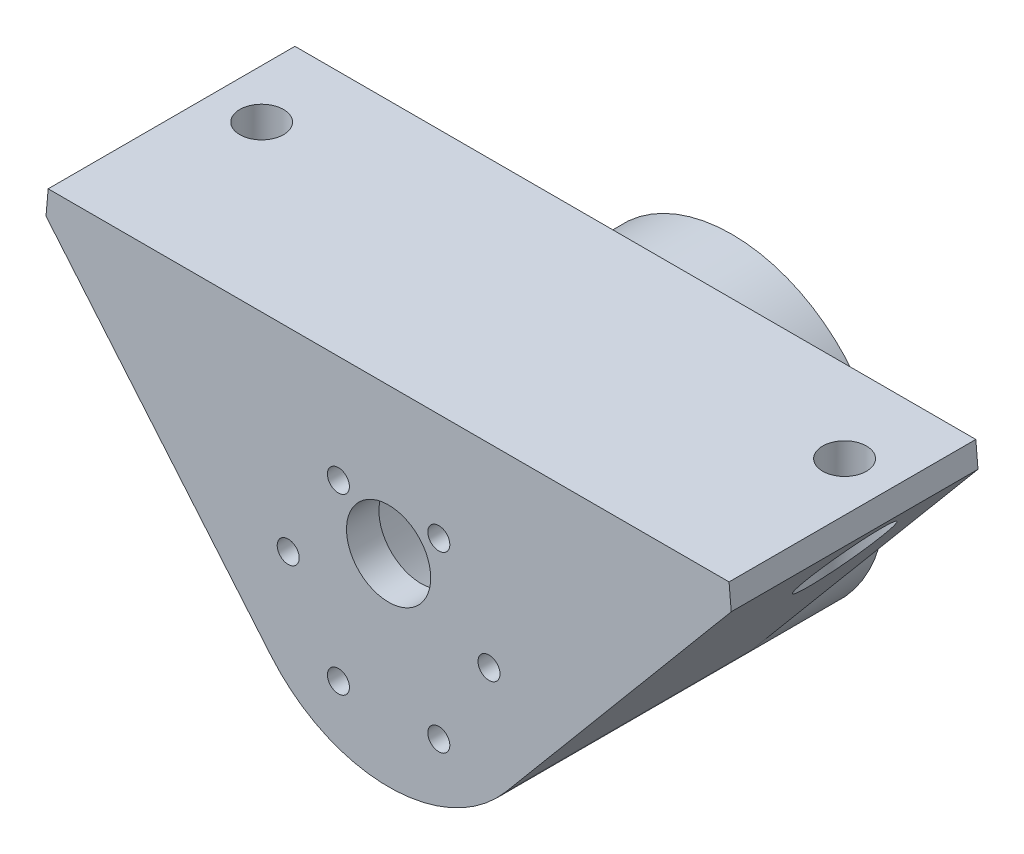
ISO-10303-21;
HEADER;
FILE_DESCRIPTION(('STEP AP214'),'2;1');
FILE_NAME('part.step','',(''),(''),'','','');
FILE_SCHEMA(('AUTOMOTIVE_DESIGN { 1 0 10303 214 1 1 1 1 }'));
ENDSEC;
DATA;
#1=APPLICATION_CONTEXT('core data for automotive mechanical design processes');
#2=APPLICATION_PROTOCOL_DEFINITION('international standard','automotive_design',2000,#1);
#3=PRODUCT_CONTEXT('',#1,'mechanical');
#4=PRODUCT('Part','Part','',(#3));
#5=PRODUCT_RELATED_PRODUCT_CATEGORY('part','',(#4));
#6=PRODUCT_DEFINITION_FORMATION('','',#4);
#7=PRODUCT_DEFINITION_CONTEXT('part definition',#1,'design');
#8=PRODUCT_DEFINITION('design','',#6,#7);
#9=PRODUCT_DEFINITION_SHAPE('','',#8);
#10=(LENGTH_UNIT() NAMED_UNIT(*) SI_UNIT(.MILLI.,.METRE.));
#11=(NAMED_UNIT(*) PLANE_ANGLE_UNIT() SI_UNIT($,.RADIAN.));
#12=(NAMED_UNIT(*) SI_UNIT($,.STERADIAN.) SOLID_ANGLE_UNIT());
#13=UNCERTAINTY_MEASURE_WITH_UNIT(LENGTH_MEASURE(1.E-05),#10,'distance_accuracy_value','');
#14=(GEOMETRIC_REPRESENTATION_CONTEXT(3) GLOBAL_UNCERTAINTY_ASSIGNED_CONTEXT((#13)) GLOBAL_UNIT_ASSIGNED_CONTEXT((#10,
#11,#12)) REPRESENTATION_CONTEXT('',''));
#15=CARTESIAN_POINT('',(0.,0.,0.));
#16=DIRECTION('',(0.,0.,1.));
#17=DIRECTION('',(1.,0.,0.));
#18=AXIS2_PLACEMENT_3D('',#15,#16,#17);
#19=CARTESIAN_POINT('',(0.,0.,-48.));
#20=DIRECTION('',(0.,0.,1.));
#21=DIRECTION('',(1.,0.,0.));
#22=AXIS2_PLACEMENT_3D('',#19,#20,#21);
#23=CYLINDRICAL_SURFACE('',#22,18.7);
#24=CARTESIAN_POINT('',(0.,0.,-48.));
#25=DIRECTION('',(0.,0.,1.));
#26=DIRECTION('',(1.,0.,0.));
#27=AXIS2_PLACEMENT_3D('',#24,#25,#26);
#28=CIRCLE('',#27,18.7);
#29=CARTESIAN_POINT('',(18.7,0.,-48.));
#30=VERTEX_POINT('',#29);
#31=EDGE_CURVE('E166',#30,#30,#28,.T.);
#32=ORIENTED_EDGE('',*,*,#31,.F.);
#33=EDGE_LOOP('',(#32));
#34=FACE_BOUND('',#33,.T.);
#35=CARTESIAN_POINT('',(0.,0.,0.));
#36=DIRECTION('',(0.,0.,1.));
#37=DIRECTION('',(1.,0.,0.));
#38=AXIS2_PLACEMENT_3D('',#35,#36,#37);
#39=CIRCLE('',#38,18.7);
#40=CARTESIAN_POINT('',(18.7,0.,0.));
#41=VERTEX_POINT('',#40);
#42=EDGE_CURVE('E163',#41,#41,#39,.T.);
#43=ORIENTED_EDGE('',*,*,#42,.T.);
#44=EDGE_LOOP('',(#43));
#45=FACE_BOUND('',#44,.T.);
#46=ADVANCED_FACE('F43',(#34,#45),#23,.F.);
#47=CARTESIAN_POINT('',(0.,0.,-48.));
#48=DIRECTION('',(0.,0.,1.));
#49=DIRECTION('',(1.,0.,0.));
#50=AXIS2_PLACEMENT_3D('',#47,#48,#49);
#51=CYLINDRICAL_SURFACE('',#50,23.7);
#52=DIRECTION('',(0.,0.,1.));
#53=VECTOR('',#52,1.);
#54=CARTESIAN_POINT('',(18.1552533019198,-15.234066349571,-33.1));
#55=LINE('',#54,#53);
#56=CARTESIAN_POINT('',(18.1552533019198,-15.234066349571,-33.1));
#57=VERTEX_POINT('',#56);
#58=CARTESIAN_POINT('',(18.1552533019198,-15.234066349571,5.));
#59=VERTEX_POINT('',#58);
#60=EDGE_CURVE('E119',#57,#59,#55,.T.);
#61=ORIENTED_EDGE('',*,*,#60,.T.);
#62=CARTESIAN_POINT('',(0.,0.,5.));
#63=DIRECTION('',(0.,0.,1.));
#64=DIRECTION('',(1.,0.,0.));
#65=AXIS2_PLACEMENT_3D('',#62,#63,#64);
#66=CIRCLE('',#65,23.7);
#67=CARTESIAN_POINT('',(-18.1552533019198,-15.234066349571,5.));
#68=VERTEX_POINT('',#67);
#69=EDGE_CURVE('E118',#68,#59,#66,.T.);
#70=ORIENTED_EDGE('',*,*,#69,.F.);
#71=DIRECTION('',(0.,0.,1.));
#72=VECTOR('',#71,1.);
#73=CARTESIAN_POINT('',(-18.1552533019198,-15.234066349571,-33.1));
#74=LINE('',#73,#72);
#75=CARTESIAN_POINT('',(-18.1552533019198,-15.234066349571,-33.1));
#76=VERTEX_POINT('',#75);
#77=EDGE_CURVE('E100',#76,#68,#74,.T.);
#78=ORIENTED_EDGE('',*,*,#77,.F.);
#79=CARTESIAN_POINT('',(0.,0.,-33.1));
#80=DIRECTION('',(0.,0.,1.));
#81=DIRECTION('',(1.,0.,0.));
#82=AXIS2_PLACEMENT_3D('',#79,#80,#81);
#83=CIRCLE('',#82,23.7);
#84=EDGE_CURVE('E104',#57,#76,#83,.T.);
#85=ORIENTED_EDGE('',*,*,#84,.F.);
#86=EDGE_LOOP('',(#61,#70,#78,#85));
#87=FACE_BOUND('',#86,.T.);
#88=CARTESIAN_POINT('',(0.,0.,-48.));
#89=DIRECTION('',(0.,0.,1.));
#90=DIRECTION('',(1.,0.,0.));
#91=AXIS2_PLACEMENT_3D('',#88,#89,#90);
#92=CIRCLE('',#91,23.7);
#93=CARTESIAN_POINT('',(23.7,0.,-48.));
#94=VERTEX_POINT('',#93);
#95=EDGE_CURVE('E169',#94,#94,#92,.T.);
#96=ORIENTED_EDGE('',*,*,#95,.T.);
#97=EDGE_LOOP('',(#96));
#98=FACE_BOUND('',#97,.T.);
#99=ADVANCED_FACE('F115',(#87,#98),#51,.T.);
#100=CARTESIAN_POINT('',(0.,0.,-48.));
#101=DIRECTION('',(0.,0.,1.));
#102=DIRECTION('',(1.,0.,0.));
#103=AXIS2_PLACEMENT_3D('',#100,#101,#102);
#104=PLANE('',#103);
#105=ORIENTED_EDGE('',*,*,#31,.T.);
#106=EDGE_LOOP('',(#105));
#107=FACE_BOUND('',#106,.T.);
#108=ORIENTED_EDGE('',*,*,#95,.F.);
#109=EDGE_LOOP('',(#108));
#110=FACE_BOUND('',#109,.T.);
#111=ADVANCED_FACE('F268',(#107,#110),#104,.F.);
#112=CARTESIAN_POINT('',(0.,0.,0.));
#113=DIRECTION('',(0.,0.,1.));
#114=DIRECTION('',(1.,0.,0.));
#115=AXIS2_PLACEMENT_3D('',#112,#113,#114);
#116=PLANE('',#115);
#117=CARTESIAN_POINT('',(-7.75000000000016,-13.4233937586587,0.));
#118=DIRECTION('',(0.,0.,1.));
#119=DIRECTION('',(1.,0.,0.));
#120=AXIS2_PLACEMENT_3D('',#117,#118,#119);
#121=CIRCLE('',#120,1.69999999999999);
#122=CARTESIAN_POINT('',(-6.05000000000017,-13.4233937586587,0.));
#123=VERTEX_POINT('',#122);
#124=EDGE_CURVE('E127',#123,#123,#121,.T.);
#125=ORIENTED_EDGE('',*,*,#124,.T.);
#126=EDGE_LOOP('',(#125));
#127=FACE_BOUND('',#126,.T.);
#128=CARTESIAN_POINT('',(7.74999999999987,-13.4233937586589,0.));
#129=DIRECTION('',(0.,0.,1.));
#130=DIRECTION('',(1.,0.,0.));
#131=AXIS2_PLACEMENT_3D('',#128,#129,#130);
#132=CIRCLE('',#131,1.69999999999999);
#133=CARTESIAN_POINT('',(9.44999999999986,-13.4233937586589,0.));
#134=VERTEX_POINT('',#133);
#135=EDGE_CURVE('E133',#134,#134,#132,.T.);
#136=ORIENTED_EDGE('',*,*,#135,.T.);
#137=EDGE_LOOP('',(#136));
#138=FACE_BOUND('',#137,.T.);
#139=CARTESIAN_POINT('',(15.5,0.,0.));
#140=DIRECTION('',(0.,0.,1.));
#141=DIRECTION('',(1.,0.,0.));
#142=AXIS2_PLACEMENT_3D('',#139,#140,#141);
#143=CIRCLE('',#142,1.69999999999999);
#144=CARTESIAN_POINT('',(17.2,0.,0.));
#145=VERTEX_POINT('',#144);
#146=EDGE_CURVE('E139',#145,#145,#143,.T.);
#147=ORIENTED_EDGE('',*,*,#146,.T.);
#148=EDGE_LOOP('',(#147));
#149=FACE_BOUND('',#148,.T.);
#150=CARTESIAN_POINT('',(7.75000000000006,13.4233937586588,0.));
#151=DIRECTION('',(0.,0.,1.));
#152=DIRECTION('',(1.,0.,0.));
#153=AXIS2_PLACEMENT_3D('',#150,#151,#152);
#154=CIRCLE('',#153,1.69999999999999);
#155=CARTESIAN_POINT('',(9.45000000000005,13.4233937586588,0.));
#156=VERTEX_POINT('',#155);
#157=EDGE_CURVE('E145',#156,#156,#154,.T.);
#158=ORIENTED_EDGE('',*,*,#157,.T.);
#159=EDGE_LOOP('',(#158));
#160=FACE_BOUND('',#159,.T.);
#161=CARTESIAN_POINT('',(-7.74999999999997,13.4233937586588,0.));
#162=DIRECTION('',(0.,0.,1.));
#163=DIRECTION('',(1.,0.,0.));
#164=AXIS2_PLACEMENT_3D('',#161,#162,#163);
#165=CIRCLE('',#164,1.69999999999999);
#166=CARTESIAN_POINT('',(-6.04999999999998,13.4233937586588,0.));
#167=VERTEX_POINT('',#166);
#168=EDGE_CURVE('E151',#167,#167,#165,.T.);
#169=ORIENTED_EDGE('',*,*,#168,.T.);
#170=EDGE_LOOP('',(#169));
#171=FACE_BOUND('',#170,.T.);
#172=CARTESIAN_POINT('',(-15.5,0.,0.));
#173=DIRECTION('',(0.,0.,1.));
#174=DIRECTION('',(1.,0.,0.));
#175=AXIS2_PLACEMENT_3D('',#172,#173,#174);
#176=CIRCLE('',#175,1.69999999999999);
#177=CARTESIAN_POINT('',(-13.8,0.,0.));
#178=VERTEX_POINT('',#177);
#179=EDGE_CURVE('E155',#178,#178,#176,.T.);
#180=ORIENTED_EDGE('',*,*,#179,.T.);
#181=EDGE_LOOP('',(#180));
#182=FACE_BOUND('',#181,.T.);
#183=CARTESIAN_POINT('',(0.,7.5,0.));
#184=DIRECTION('',(0.,0.,1.));
#185=DIRECTION('',(1.,0.,0.));
#186=AXIS2_PLACEMENT_3D('',#183,#184,#185);
#187=CIRCLE('',#186,6.5);
#188=CARTESIAN_POINT('',(6.5,7.5,0.));
#189=VERTEX_POINT('',#188);
#190=EDGE_CURVE('E158',#189,#189,#187,.T.);
#191=ORIENTED_EDGE('',*,*,#190,.T.);
#192=EDGE_LOOP('',(#191));
#193=FACE_BOUND('',#192,.T.);
#194=ORIENTED_EDGE('',*,*,#42,.F.);
#195=EDGE_LOOP('',(#194));
#196=FACE_BOUND('',#195,.T.);
#197=ADVANCED_FACE('F336',(#127,#138,#149,#160,#171,#182,#193,#196),#116,.F.);
#198=CARTESIAN_POINT('',(0.,7.5,5.));
#199=DIRECTION('',(0.,0.,-1.));
#200=DIRECTION('',(-1.,0.,0.));
#201=AXIS2_PLACEMENT_3D('',#198,#199,#200);
#202=CYLINDRICAL_SURFACE('',#201,6.5);
#203=CARTESIAN_POINT('',(0.,7.5,5.));
#204=DIRECTION('',(0.,0.,1.));
#205=DIRECTION('',(1.,0.,0.));
#206=AXIS2_PLACEMENT_3D('',#203,#204,#205);
#207=CIRCLE('',#206,6.5);
#208=CARTESIAN_POINT('',(6.5,7.5,5.));
#209=VERTEX_POINT('',#208);
#210=EDGE_CURVE('E160',#209,#209,#207,.T.);
#211=ORIENTED_EDGE('',*,*,#210,.T.);
#212=EDGE_LOOP('',(#211));
#213=FACE_BOUND('',#212,.T.);
#214=ORIENTED_EDGE('',*,*,#190,.F.);
#215=EDGE_LOOP('',(#214));
#216=FACE_BOUND('',#215,.T.);
#217=ADVANCED_FACE('F334',(#213,#216),#202,.F.);
#218=CARTESIAN_POINT('',(0.,0.,5.));
#219=DIRECTION('',(0.,0.,1.));
#220=DIRECTION('',(1.,0.,0.));
#221=AXIS2_PLACEMENT_3D('',#218,#219,#220);
#222=PLANE('',#221);
#223=CARTESIAN_POINT('',(-7.75000000000016,-13.4233937586587,5.));
#224=DIRECTION('',(0.,0.,1.));
#225=DIRECTION('',(1.,0.,0.));
#226=AXIS2_PLACEMENT_3D('',#223,#224,#225);
#227=CIRCLE('',#226,1.69999999999999);
#228=CARTESIAN_POINT('',(-6.05000000000017,-13.4233937586587,5.));
#229=VERTEX_POINT('',#228);
#230=EDGE_CURVE('E121',#229,#229,#227,.T.);
#231=ORIENTED_EDGE('',*,*,#230,.F.);
#232=EDGE_LOOP('',(#231));
#233=FACE_BOUND('',#232,.T.);
#234=CARTESIAN_POINT('',(7.74999999999987,-13.4233937586589,5.));
#235=DIRECTION('',(0.,0.,1.));
#236=DIRECTION('',(1.,0.,0.));
#237=AXIS2_PLACEMENT_3D('',#234,#235,#236);
#238=CIRCLE('',#237,1.69999999999999);
#239=CARTESIAN_POINT('',(9.44999999999986,-13.4233937586589,5.));
#240=VERTEX_POINT('',#239);
#241=EDGE_CURVE('E130',#240,#240,#238,.T.);
#242=ORIENTED_EDGE('',*,*,#241,.F.);
#243=EDGE_LOOP('',(#242));
#244=FACE_BOUND('',#243,.T.);
#245=CARTESIAN_POINT('',(15.5,0.,5.));
#246=DIRECTION('',(0.,0.,1.));
#247=DIRECTION('',(1.,0.,0.));
#248=AXIS2_PLACEMENT_3D('',#245,#246,#247);
#249=CIRCLE('',#248,1.69999999999999);
#250=CARTESIAN_POINT('',(17.2,0.,5.));
#251=VERTEX_POINT('',#250);
#252=EDGE_CURVE('E136',#251,#251,#249,.T.);
#253=ORIENTED_EDGE('',*,*,#252,.F.);
#254=EDGE_LOOP('',(#253));
#255=FACE_BOUND('',#254,.T.);
#256=CARTESIAN_POINT('',(7.75000000000006,13.4233937586588,5.));
#257=DIRECTION('',(0.,0.,1.));
#258=DIRECTION('',(1.,0.,0.));
#259=AXIS2_PLACEMENT_3D('',#256,#257,#258);
#260=CIRCLE('',#259,1.69999999999999);
#261=CARTESIAN_POINT('',(9.45000000000005,13.4233937586588,5.));
#262=VERTEX_POINT('',#261);
#263=EDGE_CURVE('E142',#262,#262,#260,.T.);
#264=ORIENTED_EDGE('',*,*,#263,.F.);
#265=EDGE_LOOP('',(#264));
#266=FACE_BOUND('',#265,.T.);
#267=CARTESIAN_POINT('',(-7.74999999999997,13.4233937586588,5.));
#268=DIRECTION('',(0.,0.,1.));
#269=DIRECTION('',(1.,0.,0.));
#270=AXIS2_PLACEMENT_3D('',#267,#268,#269);
#271=CIRCLE('',#270,1.69999999999999);
#272=CARTESIAN_POINT('',(-6.04999999999998,13.4233937586588,5.));
#273=VERTEX_POINT('',#272);
#274=EDGE_CURVE('E148',#273,#273,#271,.T.);
#275=ORIENTED_EDGE('',*,*,#274,.F.);
#276=EDGE_LOOP('',(#275));
#277=FACE_BOUND('',#276,.T.);
#278=CARTESIAN_POINT('',(-15.5,0.,5.));
#279=DIRECTION('',(0.,0.,1.));
#280=DIRECTION('',(1.,0.,0.));
#281=AXIS2_PLACEMENT_3D('',#278,#279,#280);
#282=CIRCLE('',#281,1.69999999999999);
#283=CARTESIAN_POINT('',(-13.8,0.,5.));
#284=VERTEX_POINT('',#283);
#285=EDGE_CURVE('E152',#284,#284,#282,.T.);
#286=ORIENTED_EDGE('',*,*,#285,.F.);
#287=EDGE_LOOP('',(#286));
#288=FACE_BOUND('',#287,.T.);
#289=DIRECTION('',(-0.642787609686538,-0.766044443118979,0.));
#290=VECTOR('',#289,1.);
#291=CARTESIAN_POINT('',(18.1552533019198,-15.234066349571,5.));
#292=LINE('',#291,#290);
#293=CARTESIAN_POINT('',(52.8972036440606,26.1697777844051,5.));
#294=VERTEX_POINT('',#293);
#295=EDGE_CURVE('E216',#294,#59,#292,.T.);
#296=ORIENTED_EDGE('',*,*,#295,.F.);
#297=DIRECTION('',(0.0871557427476541,-0.996194698091746,0.));
#298=VECTOR('',#297,1.);
#299=CARTESIAN_POINT('',(54.7675570638037,4.79154037209174,5.));
#300=LINE('',#299,#298);
#301=CARTESIAN_POINT('',(52.5621026214109,30.,5.));
#302=VERTEX_POINT('',#301);
#303=EDGE_CURVE('E195',#294,#302,#300,.F.);
#304=ORIENTED_EDGE('',*,*,#303,.T.);
#305=DIRECTION('',(1.,0.,0.));
#306=VECTOR('',#305,1.);
#307=CARTESIAN_POINT('',(0.,30.,5.));
#308=LINE('',#307,#306);
#309=CARTESIAN_POINT('',(-52.5621026214109,30.,5.));
#310=VERTEX_POINT('',#309);
#311=EDGE_CURVE('E215',#310,#302,#308,.T.);
#312=ORIENTED_EDGE('',*,*,#311,.F.);
#313=DIRECTION('',(-0.0871557427476587,-0.996194698091746,0.));
#314=VECTOR('',#313,1.);
#315=CARTESIAN_POINT('',(-54.7675570638037,4.791540372092,5.));
#316=LINE('',#315,#314);
#317=CARTESIAN_POINT('',(-52.8972036440606,26.1697777844051,5.));
#318=VERTEX_POINT('',#317);
#319=EDGE_CURVE('E193',#310,#318,#316,.T.);
#320=ORIENTED_EDGE('',*,*,#319,.T.);
#321=DIRECTION('',(0.642787609686538,-0.766044443118979,0.));
#322=VECTOR('',#321,1.);
#323=CARTESIAN_POINT('',(-18.1552533019198,-15.234066349571,5.));
#324=LINE('',#323,#322);
#325=EDGE_CURVE('E208',#318,#68,#324,.T.);
#326=ORIENTED_EDGE('',*,*,#325,.T.);
#327=ORIENTED_EDGE('',*,*,#69,.T.);
#328=EDGE_LOOP('',(#296,#304,#312,#320,#326,#327));
#329=FACE_BOUND('',#328,.T.);
#330=ORIENTED_EDGE('',*,*,#210,.F.);
#331=EDGE_LOOP('',(#330));
#332=FACE_BOUND('',#331,.T.);
#333=ADVANCED_FACE('F213',(#233,#244,#255,#266,#277,#288,#329,#332),#222,.T.);
#334=CARTESIAN_POINT('',(-15.5,0.,5.));
#335=DIRECTION('',(0.,0.,1.));
#336=DIRECTION('',(1.,0.,0.));
#337=AXIS2_PLACEMENT_3D('',#334,#335,#336);
#338=CYLINDRICAL_SURFACE('',#337,1.69999999999999);
#339=ORIENTED_EDGE('',*,*,#285,.T.);
#340=EDGE_LOOP('',(#339));
#341=FACE_BOUND('',#340,.T.);
#342=ORIENTED_EDGE('',*,*,#179,.F.);
#343=EDGE_LOOP('',(#342));
#344=FACE_BOUND('',#343,.T.);
#345=ADVANCED_FACE('F328',(#341,#344),#338,.F.);
#346=CARTESIAN_POINT('',(-7.74999999999997,13.4233937586588,5.));
#347=DIRECTION('',(0.,0.,1.));
#348=DIRECTION('',(1.,0.,0.));
#349=AXIS2_PLACEMENT_3D('',#346,#347,#348);
#350=CYLINDRICAL_SURFACE('',#349,1.69999999999999);
#351=ORIENTED_EDGE('',*,*,#274,.T.);
#352=EDGE_LOOP('',(#351));
#353=FACE_BOUND('',#352,.T.);
#354=ORIENTED_EDGE('',*,*,#168,.F.);
#355=EDGE_LOOP('',(#354));
#356=FACE_BOUND('',#355,.T.);
#357=ADVANCED_FACE('F324',(#353,#356),#350,.F.);
#358=CARTESIAN_POINT('',(7.75000000000006,13.4233937586588,5.));
#359=DIRECTION('',(0.,0.,1.));
#360=DIRECTION('',(1.,0.,0.));
#361=AXIS2_PLACEMENT_3D('',#358,#359,#360);
#362=CYLINDRICAL_SURFACE('',#361,1.69999999999999);
#363=ORIENTED_EDGE('',*,*,#263,.T.);
#364=EDGE_LOOP('',(#363));
#365=FACE_BOUND('',#364,.T.);
#366=ORIENTED_EDGE('',*,*,#157,.F.);
#367=EDGE_LOOP('',(#366));
#368=FACE_BOUND('',#367,.T.);
#369=ADVANCED_FACE('F320',(#365,#368),#362,.F.);
#370=CARTESIAN_POINT('',(15.5,0.,5.));
#371=DIRECTION('',(0.,0.,1.));
#372=DIRECTION('',(1.,0.,0.));
#373=AXIS2_PLACEMENT_3D('',#370,#371,#372);
#374=CYLINDRICAL_SURFACE('',#373,1.69999999999999);
#375=ORIENTED_EDGE('',*,*,#252,.T.);
#376=EDGE_LOOP('',(#375));
#377=FACE_BOUND('',#376,.T.);
#378=ORIENTED_EDGE('',*,*,#146,.F.);
#379=EDGE_LOOP('',(#378));
#380=FACE_BOUND('',#379,.T.);
#381=ADVANCED_FACE('F316',(#377,#380),#374,.F.);
#382=CARTESIAN_POINT('',(7.74999999999987,-13.4233937586589,5.));
#383=DIRECTION('',(0.,0.,1.));
#384=DIRECTION('',(1.,0.,0.));
#385=AXIS2_PLACEMENT_3D('',#382,#383,#384);
#386=CYLINDRICAL_SURFACE('',#385,1.69999999999999);
#387=ORIENTED_EDGE('',*,*,#241,.T.);
#388=EDGE_LOOP('',(#387));
#389=FACE_BOUND('',#388,.T.);
#390=ORIENTED_EDGE('',*,*,#135,.F.);
#391=EDGE_LOOP('',(#390));
#392=FACE_BOUND('',#391,.T.);
#393=ADVANCED_FACE('F312',(#389,#392),#386,.F.);
#394=CARTESIAN_POINT('',(-7.75000000000016,-13.4233937586587,5.));
#395=DIRECTION('',(0.,0.,1.));
#396=DIRECTION('',(1.,0.,0.));
#397=AXIS2_PLACEMENT_3D('',#394,#395,#396);
#398=CYLINDRICAL_SURFACE('',#397,1.69999999999999);
#399=ORIENTED_EDGE('',*,*,#230,.T.);
#400=EDGE_LOOP('',(#399));
#401=FACE_BOUND('',#400,.T.);
#402=ORIENTED_EDGE('',*,*,#124,.F.);
#403=EDGE_LOOP('',(#402));
#404=FACE_BOUND('',#403,.T.);
#405=ADVANCED_FACE('F306',(#401,#404),#398,.F.);
#406=CARTESIAN_POINT('',(18.1552533019198,-15.234066349571,-33.1));
#407=DIRECTION('',(-0.766044443118979,0.642787609686538,0.));
#408=DIRECTION('',(-0.642787609686538,-0.766044443118979,0.));
#409=AXIS2_PLACEMENT_3D('',#406,#407,#408);
#410=PLANE('',#409);
#411=CARTESIAN_POINT('',(45.,16.7582569701478,-20.4));
#412=DIRECTION('',(-0.766044443118979,0.642787609686538,0.));
#413=DIRECTION('',(0.642787609686538,0.766044443118979,0.));
#414=AXIS2_PLACEMENT_3D('',#411,#412,#413);
#415=ELLIPSE('',#414,8.89096167050728,5.715);
#416=CARTESIAN_POINT('',(50.715,23.5691287518237,-20.4));
#417=VERTEX_POINT('',#416);
#418=EDGE_CURVE('E187',#417,#417,#415,.T.);
#419=ORIENTED_EDGE('',*,*,#418,.T.);
#420=EDGE_LOOP('',(#419));
#421=FACE_BOUND('',#420,.T.);
#422=DIRECTION('',(-0.642787609686538,-0.766044443118979,0.));
#423=VECTOR('',#422,1.);
#424=CARTESIAN_POINT('',(18.1552533019198,-15.234066349571,-33.1));
#425=LINE('',#424,#423);
#426=CARTESIAN_POINT('',(52.8972036440606,26.1697777844051,-33.1));
#427=VERTEX_POINT('',#426);
#428=EDGE_CURVE('E110',#427,#57,#425,.T.);
#429=ORIENTED_EDGE('',*,*,#428,.F.);
#430=DIRECTION('',(0.,0.,1.));
#431=VECTOR('',#430,1.);
#432=CARTESIAN_POINT('',(52.8972036440606,26.1697777844051,-33.1));
#433=LINE('',#432,#431);
#434=EDGE_CURVE('E172',#427,#294,#433,.T.);
#435=ORIENTED_EDGE('',*,*,#434,.T.);
#436=ORIENTED_EDGE('',*,*,#295,.T.);
#437=ORIENTED_EDGE('',*,*,#60,.F.);
#438=EDGE_LOOP('',(#429,#435,#436,#437));
#439=FACE_BOUND('',#438,.T.);
#440=ADVANCED_FACE('F206',(#421,#439),#410,.F.);
#441=CARTESIAN_POINT('',(-18.1552533019198,-15.234066349571,-33.1));
#442=DIRECTION('',(-0.766044443118979,-0.642787609686538,0.));
#443=DIRECTION('',(0.642787609686538,-0.766044443118979,0.));
#444=AXIS2_PLACEMENT_3D('',#441,#442,#443);
#445=PLANE('',#444);
#446=CARTESIAN_POINT('',(-45.,16.7582569701478,-20.4));
#447=DIRECTION('',(-0.766044443118979,-0.642787609686538,0.));
#448=DIRECTION('',(-0.642787609686538,0.766044443118979,0.));
#449=AXIS2_PLACEMENT_3D('',#446,#447,#448);
#450=ELLIPSE('',#449,8.89096167050727,5.715);
#451=CARTESIAN_POINT('',(-50.715,23.5691287518237,-20.4));
#452=VERTEX_POINT('',#451);
#453=EDGE_CURVE('E184',#452,#452,#450,.T.);
#454=ORIENTED_EDGE('',*,*,#453,.F.);
#455=EDGE_LOOP('',(#454));
#456=FACE_BOUND('',#455,.T.);
#457=ORIENTED_EDGE('',*,*,#325,.F.);
#458=DIRECTION('',(0.,0.,-1.));
#459=VECTOR('',#458,1.);
#460=CARTESIAN_POINT('',(-52.8972036440606,26.1697777844051,-33.1));
#461=LINE('',#460,#459);
#462=CARTESIAN_POINT('',(-52.8972036440606,26.1697777844051,-33.1));
#463=VERTEX_POINT('',#462);
#464=EDGE_CURVE('E11',#318,#463,#461,.T.);
#465=ORIENTED_EDGE('',*,*,#464,.T.);
#466=DIRECTION('',(0.642787609686538,-0.766044443118979,0.));
#467=VECTOR('',#466,1.);
#468=CARTESIAN_POINT('',(-18.1552533019198,-15.234066349571,-33.1));
#469=LINE('',#468,#467);
#470=EDGE_CURVE('E96',#463,#76,#469,.T.);
#471=ORIENTED_EDGE('',*,*,#470,.T.);
#472=ORIENTED_EDGE('',*,*,#77,.T.);
#473=EDGE_LOOP('',(#457,#465,#471,#472));
#474=FACE_BOUND('',#473,.T.);
#475=ADVANCED_FACE('F98',(#456,#474),#445,.T.);
#476=CARTESIAN_POINT('',(0.,30.,-33.1));
#477=DIRECTION('',(0.,-1.,0.));
#478=DIRECTION('',(1.,0.,0.));
#479=AXIS2_PLACEMENT_3D('',#476,#477,#478);
#480=PLANE('',#479);
#481=CARTESIAN_POINT('',(-45.,30.,-20.4));
#482=DIRECTION('',(0.,1.,0.));
#483=DIRECTION('',(0.,0.,1.));
#484=AXIS2_PLACEMENT_3D('',#481,#482,#483);
#485=CIRCLE('',#484,3.3782);
#486=CARTESIAN_POINT('',(-45.,30.,-17.0218));
#487=VERTEX_POINT('',#486);
#488=EDGE_CURVE('E190',#487,#487,#485,.T.);
#489=ORIENTED_EDGE('',*,*,#488,.F.);
#490=EDGE_LOOP('',(#489));
#491=FACE_BOUND('',#490,.T.);
#492=CARTESIAN_POINT('',(45.,30.,-20.4));
#493=DIRECTION('',(0.,1.,0.));
#494=DIRECTION('',(0.,0.,1.));
#495=AXIS2_PLACEMENT_3D('',#492,#493,#494);
#496=CIRCLE('',#495,3.3782);
#497=CARTESIAN_POINT('',(45.,30.,-17.0218));
#498=VERTEX_POINT('',#497);
#499=EDGE_CURVE('E220',#498,#498,#496,.T.);
#500=ORIENTED_EDGE('',*,*,#499,.F.);
#501=EDGE_LOOP('',(#500));
#502=FACE_BOUND('',#501,.T.);
#503=ORIENTED_EDGE('',*,*,#311,.T.);
#504=DIRECTION('',(0.,0.,-1.));
#505=VECTOR('',#504,1.);
#506=CARTESIAN_POINT('',(52.5621026214109,30.,-33.1));
#507=LINE('',#506,#505);
#508=CARTESIAN_POINT('',(52.5621026214109,30.,-33.1));
#509=VERTEX_POINT('',#508);
#510=EDGE_CURVE('E65',#302,#509,#507,.T.);
#511=ORIENTED_EDGE('',*,*,#510,.T.);
#512=DIRECTION('',(1.,0.,0.));
#513=VECTOR('',#512,1.);
#514=CARTESIAN_POINT('',(0.,30.,-33.1));
#515=LINE('',#514,#513);
#516=CARTESIAN_POINT('',(-52.5621026214109,30.,-33.1));
#517=VERTEX_POINT('',#516);
#518=EDGE_CURVE('E105',#517,#509,#515,.T.);
#519=ORIENTED_EDGE('',*,*,#518,.F.);
#520=DIRECTION('',(0.,0.,1.));
#521=VECTOR('',#520,1.);
#522=CARTESIAN_POINT('',(-52.5621026214109,30.,5.));
#523=LINE('',#522,#521);
#524=EDGE_CURVE('E197',#517,#310,#523,.T.);
#525=ORIENTED_EDGE('',*,*,#524,.T.);
#526=EDGE_LOOP('',(#503,#511,#519,#525));
#527=FACE_BOUND('',#526,.T.);
#528=ADVANCED_FACE('F217',(#491,#502,#527),#480,.F.);
#529=CARTESIAN_POINT('',(0.,0.,-33.1));
#530=DIRECTION('',(0.,0.,1.));
#531=DIRECTION('',(1.,0.,0.));
#532=AXIS2_PLACEMENT_3D('',#529,#530,#531);
#533=PLANE('',#532);
#534=ORIENTED_EDGE('',*,*,#518,.T.);
#535=DIRECTION('',(-0.0871557427476541,0.996194698091746,0.));
#536=VECTOR('',#535,1.);
#537=CARTESIAN_POINT('',(52.8972036440606,26.1697777844051,-33.1));
#538=LINE('',#537,#536);
#539=EDGE_CURVE('E52',#509,#427,#538,.F.);
#540=ORIENTED_EDGE('',*,*,#539,.T.);
#541=ORIENTED_EDGE('',*,*,#428,.T.);
#542=ORIENTED_EDGE('',*,*,#84,.T.);
#543=ORIENTED_EDGE('',*,*,#470,.F.);
#544=DIRECTION('',(0.0871557427476587,0.996194698091746,0.));
#545=VECTOR('',#544,1.);
#546=CARTESIAN_POINT('',(-52.5621026214109,30.,-33.1));
#547=LINE('',#546,#545);
#548=EDGE_CURVE('E201',#463,#517,#547,.T.);
#549=ORIENTED_EDGE('',*,*,#548,.T.);
#550=EDGE_LOOP('',(#534,#540,#541,#542,#543,#549));
#551=FACE_BOUND('',#550,.T.);
#552=ADVANCED_FACE('F108',(#551),#533,.F.);
#553=CARTESIAN_POINT('',(45.,30.,-20.4));
#554=DIRECTION('',(0.,1.,0.));
#555=DIRECTION('',(0.,0.,1.));
#556=AXIS2_PLACEMENT_3D('',#553,#554,#555);
#557=CYLINDRICAL_SURFACE('',#556,3.37819999999999);
#558=CARTESIAN_POINT('',(45.,25.,-20.4));
#559=DIRECTION('',(0.,1.,0.));
#560=DIRECTION('',(-1.,0.,0.));
#561=AXIS2_PLACEMENT_3D('',#558,#559,#560);
#562=CIRCLE('',#561,3.37819999999999);
#563=CARTESIAN_POINT('',(41.6218,25.,-20.4));
#564=VERTEX_POINT('',#563);
#565=EDGE_CURVE('E180',#564,#564,#562,.F.);
#566=ORIENTED_EDGE('',*,*,#565,.T.);
#567=EDGE_LOOP('',(#566));
#568=FACE_BOUND('',#567,.T.);
#569=ORIENTED_EDGE('',*,*,#499,.T.);
#570=EDGE_LOOP('',(#569));
#571=FACE_BOUND('',#570,.T.);
#572=ADVANCED_FACE('F245',(#568,#571),#557,.F.);
#573=CARTESIAN_POINT('',(-45.,30.,-20.4));
#574=DIRECTION('',(0.,1.,0.));
#575=DIRECTION('',(0.,0.,1.));
#576=AXIS2_PLACEMENT_3D('',#573,#574,#575);
#577=CYLINDRICAL_SURFACE('',#576,3.37819999999999);
#578=CARTESIAN_POINT('',(-45.,25.,-20.4));
#579=DIRECTION('',(0.,1.,0.));
#580=DIRECTION('',(-1.,0.,0.));
#581=AXIS2_PLACEMENT_3D('',#578,#579,#580);
#582=CIRCLE('',#581,3.37819999999999);
#583=CARTESIAN_POINT('',(-48.3782,25.,-20.4));
#584=VERTEX_POINT('',#583);
#585=EDGE_CURVE('E177',#584,#584,#582,.F.);
#586=ORIENTED_EDGE('',*,*,#585,.T.);
#587=EDGE_LOOP('',(#586));
#588=FACE_BOUND('',#587,.T.);
#589=ORIENTED_EDGE('',*,*,#488,.T.);
#590=EDGE_LOOP('',(#589));
#591=FACE_BOUND('',#590,.T.);
#592=ADVANCED_FACE('F239',(#588,#591),#577,.F.);
#593=CARTESIAN_POINT('',(-45.,25.,-20.4));
#594=DIRECTION('',(0.,1.,0.));
#595=DIRECTION('',(-1.,0.,0.));
#596=AXIS2_PLACEMENT_3D('',#593,#594,#595);
#597=PLANE('',#596);
#598=CARTESIAN_POINT('',(-45.,25.,-20.4));
#599=DIRECTION('',(0.,1.,0.));
#600=DIRECTION('',(-1.,0.,0.));
#601=AXIS2_PLACEMENT_3D('',#598,#599,#600);
#602=CIRCLE('',#601,5.715);
#603=CARTESIAN_POINT('',(-50.715,25.,-20.4));
#604=VERTEX_POINT('',#603);
#605=EDGE_CURVE('E181',#604,#604,#602,.T.);
#606=ORIENTED_EDGE('',*,*,#605,.F.);
#607=EDGE_LOOP('',(#606));
#608=FACE_BOUND('',#607,.T.);
#609=ORIENTED_EDGE('',*,*,#585,.F.);
#610=EDGE_LOOP('',(#609));
#611=FACE_BOUND('',#610,.T.);
#612=ADVANCED_FACE('F236',(#608,#611),#597,.F.);
#613=CARTESIAN_POINT('',(-45.,-23.7,-20.4));
#614=DIRECTION('',(0.,1.,0.));
#615=DIRECTION('',(-1.,0.,0.));
#616=AXIS2_PLACEMENT_3D('',#613,#614,#615);
#617=CYLINDRICAL_SURFACE('',#616,5.715);
#618=ORIENTED_EDGE('',*,*,#453,.T.);
#619=EDGE_LOOP('',(#618));
#620=FACE_BOUND('',#619,.T.);
#621=ORIENTED_EDGE('',*,*,#605,.T.);
#622=EDGE_LOOP('',(#621));
#623=FACE_BOUND('',#622,.T.);
#624=ADVANCED_FACE('F234',(#620,#623),#617,.F.);
#625=CARTESIAN_POINT('',(45.,-23.7,-20.4));
#626=DIRECTION('',(0.,1.,0.));
#627=DIRECTION('',(-1.,0.,0.));
#628=AXIS2_PLACEMENT_3D('',#625,#626,#627);
#629=CYLINDRICAL_SURFACE('',#628,5.715);
#630=CARTESIAN_POINT('',(45.,25.,-20.4));
#631=DIRECTION('',(0.,1.,0.));
#632=DIRECTION('',(-1.,0.,0.));
#633=AXIS2_PLACEMENT_3D('',#630,#631,#632);
#634=CIRCLE('',#633,5.715);
#635=CARTESIAN_POINT('',(39.285,25.,-20.4));
#636=VERTEX_POINT('',#635);
#637=EDGE_CURVE('E228',#636,#636,#634,.T.);
#638=ORIENTED_EDGE('',*,*,#637,.T.);
#639=EDGE_LOOP('',(#638));
#640=FACE_BOUND('',#639,.T.);
#641=ORIENTED_EDGE('',*,*,#418,.F.);
#642=EDGE_LOOP('',(#641));
#643=FACE_BOUND('',#642,.T.);
#644=ADVANCED_FACE('F283',(#640,#643),#629,.F.);
#645=CARTESIAN_POINT('',(45.,25.,-20.4));
#646=DIRECTION('',(0.,1.,0.));
#647=DIRECTION('',(-1.,0.,0.));
#648=AXIS2_PLACEMENT_3D('',#645,#646,#647);
#649=PLANE('',#648);
#650=ORIENTED_EDGE('',*,*,#637,.F.);
#651=EDGE_LOOP('',(#650));
#652=FACE_BOUND('',#651,.T.);
#653=ORIENTED_EDGE('',*,*,#565,.F.);
#654=EDGE_LOOP('',(#653));
#655=FACE_BOUND('',#654,.T.);
#656=ADVANCED_FACE('F277',(#652,#655),#649,.F.);
#657=CARTESIAN_POINT('',(52.8972036440606,26.1697777844051,-33.1));
#658=DIRECTION('',(-0.996194698091746,-0.0871557427476541,0.));
#659=DIRECTION('',(0.,0.,1.));
#660=AXIS2_PLACEMENT_3D('',#657,#658,#659);
#661=PLANE('',#660);
#662=ORIENTED_EDGE('',*,*,#539,.F.);
#663=ORIENTED_EDGE('',*,*,#510,.F.);
#664=ORIENTED_EDGE('',*,*,#303,.F.);
#665=ORIENTED_EDGE('',*,*,#434,.F.);
#666=EDGE_LOOP('',(#662,#663,#664,#665));
#667=FACE_BOUND('',#666,.T.);
#668=ADVANCED_FACE('F210',(#667),#661,.F.);
#669=CARTESIAN_POINT('',(-52.5621026214109,30.,-33.1));
#670=DIRECTION('',(-0.996194698091746,0.0871557427476587,0.));
#671=DIRECTION('',(0.,0.,-1.));
#672=AXIS2_PLACEMENT_3D('',#669,#670,#671);
#673=PLANE('',#672);
#674=ORIENTED_EDGE('',*,*,#548,.F.);
#675=ORIENTED_EDGE('',*,*,#464,.F.);
#676=ORIENTED_EDGE('',*,*,#319,.F.);
#677=ORIENTED_EDGE('',*,*,#524,.F.);
#678=EDGE_LOOP('',(#674,#675,#676,#677));
#679=FACE_BOUND('',#678,.T.);
#680=ADVANCED_FACE('F46',(#679),#673,.T.);
#681=CLOSED_SHELL('',(#46,#99,#111,#197,#217,#333,#345,#357,#369,#381,#393,#405,#440,#475,#528,
#552,#572,#592,#612,#624,#644,#656,#668,#680));
#682=MANIFOLD_SOLID_BREP('B2',#681);
#683=ADVANCED_BREP_SHAPE_REPRESENTATION('',(#18,#682),#14);
#684=SHAPE_DEFINITION_REPRESENTATION(#9,#683);
ENDSEC;
END-ISO-10303-21;
